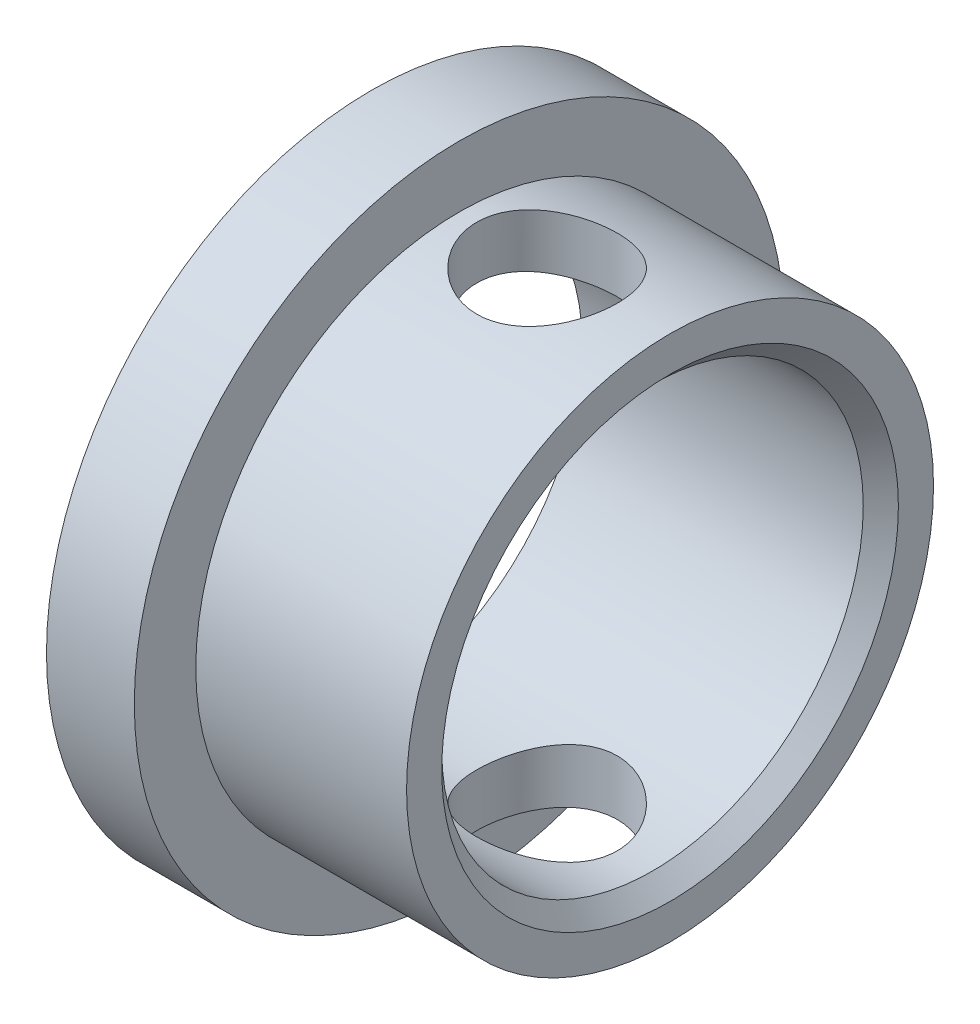
ISO-10303-21;
HEADER;
FILE_DESCRIPTION(('STEP AP214'),'2;1');
FILE_NAME('part.step','',(''),(''),'','','');
FILE_SCHEMA(('AUTOMOTIVE_DESIGN { 1 0 10303 214 1 1 1 1 }'));
ENDSEC;
DATA;
#1=APPLICATION_CONTEXT('core data for automotive mechanical design processes');
#2=APPLICATION_PROTOCOL_DEFINITION('international standard','automotive_design',2000,#1);
#3=PRODUCT_CONTEXT('',#1,'mechanical');
#4=PRODUCT('Part','Part','',(#3));
#5=PRODUCT_RELATED_PRODUCT_CATEGORY('part','',(#4));
#6=PRODUCT_DEFINITION_FORMATION('','',#4);
#7=PRODUCT_DEFINITION_CONTEXT('part definition',#1,'design');
#8=PRODUCT_DEFINITION('design','',#6,#7);
#9=PRODUCT_DEFINITION_SHAPE('','',#8);
#10=(LENGTH_UNIT() NAMED_UNIT(*) SI_UNIT(.MILLI.,.METRE.));
#11=(NAMED_UNIT(*) PLANE_ANGLE_UNIT() SI_UNIT($,.RADIAN.));
#12=(NAMED_UNIT(*) SI_UNIT($,.STERADIAN.) SOLID_ANGLE_UNIT());
#13=UNCERTAINTY_MEASURE_WITH_UNIT(LENGTH_MEASURE(1.E-05),#10,'distance_accuracy_value','');
#14=(GEOMETRIC_REPRESENTATION_CONTEXT(3) GLOBAL_UNCERTAINTY_ASSIGNED_CONTEXT((#13)) GLOBAL_UNIT_ASSIGNED_CONTEXT((#10,
#11,#12)) REPRESENTATION_CONTEXT('',''));
#15=CARTESIAN_POINT('',(0.,0.,0.));
#16=DIRECTION('',(0.,0.,1.));
#17=DIRECTION('',(1.,0.,0.));
#18=AXIS2_PLACEMENT_3D('',#15,#16,#17);
#19=CARTESIAN_POINT('',(12.,0.,0.));
#20=DIRECTION('',(1.,0.,0.));
#21=DIRECTION('',(0.,0.,-1.));
#22=AXIS2_PLACEMENT_3D('',#19,#20,#21);
#23=PLANE('',#22);
#24=CARTESIAN_POINT('',(12.,0.,0.));
#25=DIRECTION('',(1.,0.,0.));
#26=DIRECTION('',(0.,0.,-1.));
#27=AXIS2_PLACEMENT_3D('',#24,#25,#26);
#28=CIRCLE('',#27,13.);
#29=CARTESIAN_POINT('',(12.,0.,-13.));
#30=VERTEX_POINT('',#29);
#31=EDGE_CURVE('E10',#30,#30,#28,.F.);
#32=ORIENTED_EDGE('',*,*,#31,.T.);
#33=EDGE_LOOP('',(#32));
#34=FACE_BOUND('',#33,.T.);
#35=CARTESIAN_POINT('',(12.,0.,0.));
#36=DIRECTION('',(1.,0.,0.));
#37=DIRECTION('',(0.,0.,-1.));
#38=AXIS2_PLACEMENT_3D('',#35,#36,#37);
#39=CIRCLE('',#38,15.);
#40=CARTESIAN_POINT('',(12.,0.,-15.));
#41=VERTEX_POINT('',#40);
#42=EDGE_CURVE('E49',#41,#41,#39,.T.);
#43=ORIENTED_EDGE('',*,*,#42,.T.);
#44=EDGE_LOOP('',(#43));
#45=FACE_BOUND('',#44,.T.);
#46=ADVANCED_FACE('F32',(#34,#45),#23,.T.);
#47=CARTESIAN_POINT('',(12.,0.,0.));
#48=DIRECTION('',(-1.,0.,0.));
#49=DIRECTION('',(0.,0.,1.));
#50=AXIS2_PLACEMENT_3D('',#47,#48,#49);
#51=CYLINDRICAL_SURFACE('',#50,15.);
#52=CARTESIAN_POINT('',(5.,-14.456832294801,4.));
#53=CARTESIAN_POINT('',(5.22035187548057,-14.456836113945,3.99999468631742));
#54=CARTESIAN_POINT('',(5.44076000095203,-14.4619252909935,3.98172986449485));
#55=CARTESIAN_POINT('',(5.87521084311275,-14.4816712231019,3.90929166520474));
#56=CARTESIAN_POINT('',(6.08925030995612,-14.4963327781587,3.85510027241905));
#57=CARTESIAN_POINT('',(6.50461613989356,-14.5334475035368,3.71271691120147));
#58=CARTESIAN_POINT('',(6.70595991765685,-14.5558897136841,3.62457275084355));
#59=CARTESIAN_POINT('',(7.09103348011965,-14.606023098408,3.41693569127407));
#60=CARTESIAN_POINT('',(7.27476189501397,-14.6337146806885,3.29744035682899));
#61=CARTESIAN_POINT('',(7.62398509397544,-14.6920027910693,3.02729695749119));
#62=CARTESIAN_POINT('',(7.78897403492892,-14.7226508223289,2.87600595008417));
#63=CARTESIAN_POINT('',(8.0915631539024,-14.7829540287301,2.54794854568042));
#64=CARTESIAN_POINT('',(8.22916049228359,-14.8126091006688,2.37117951069329));
#65=CARTESIAN_POINT('',(8.47516987680586,-14.8681597693684,1.99367634174654));
#66=CARTESIAN_POINT('',(8.58307903726571,-14.8939875252459,1.79260363975896));
#67=CARTESIAN_POINT('',(8.76336927073451,-14.9383825242367,1.37436608945818));
#68=CARTESIAN_POINT('',(8.83575633456311,-14.9569509915253,1.1572039617502));
#69=CARTESIAN_POINT('',(8.94131044047154,-14.9843710715292,0.718231923620179));
#70=CARTESIAN_POINT('',(8.97533795325184,-14.9934355350053,0.496642448401832));
#71=CARTESIAN_POINT('',(9.00591424021435,-15.001570492355,0.0507271070171479));
#72=CARTESIAN_POINT('',(9.00246928726027,-15.0006426589323,-0.173598294877067));
#73=CARTESIAN_POINT('',(8.95880437492107,-14.9890535171952,-0.61262847422269));
#74=CARTESIAN_POINT('',(8.91951408472746,-14.9786382805395,-0.827433201442203));
#75=CARTESIAN_POINT('',(8.80677572443606,-14.9495349718099,-1.24728263114213));
#76=CARTESIAN_POINT('',(8.73332570662777,-14.9308464280136,-1.45232677636123));
#77=CARTESIAN_POINT('',(8.55364030481539,-14.886931381996,-1.84920789029504));
#78=CARTESIAN_POINT('',(8.44708638579915,-14.8616417575466,-2.04089337265881));
#79=CARTESIAN_POINT('',(8.20446236098126,-14.8072493701969,-2.40397999752931));
#80=CARTESIAN_POINT('',(8.0683865019416,-14.7781458644853,-2.57537717617274));
#81=CARTESIAN_POINT('',(7.76564628413429,-14.7182254587483,-2.89857073893016));
#82=CARTESIAN_POINT('',(7.59817110990927,-14.6873833872759,-3.04960384035149));
#83=CARTESIAN_POINT('',(7.23995064751438,-14.6282681005693,-3.32162664209938));
#84=CARTESIAN_POINT('',(7.04920394156929,-14.5999950420307,-3.44261451061104));
#85=CARTESIAN_POINT('',(6.64819979638067,-14.549118045243,-3.651693583714));
#86=CARTESIAN_POINT('',(6.43782929827193,-14.5265501404503,-3.73957733196031));
#87=CARTESIAN_POINT('',(6.00454700119227,-14.4900865003605,-3.87848003366226));
#88=CARTESIAN_POINT('',(5.7816383271305,-14.4761886145698,-3.92950812921312));
#89=CARTESIAN_POINT('',(5.3367455779215,-14.459096712616,-3.99193514186922));
#90=CARTESIAN_POINT('',(5.11493290275154,-14.4555952643646,-4.00447265242678));
#91=CARTESIAN_POINT('',(4.67238045438873,-14.4588515677209,-3.99269962245616));
#92=CARTESIAN_POINT('',(4.45164056952165,-14.4656082275034,-3.96839300344559));
#93=CARTESIAN_POINT('',(4.02188681181539,-14.4883224864021,-3.88462543740026));
#94=CARTESIAN_POINT('',(3.81272912412513,-14.5041007939926,-3.82584895825867));
#95=CARTESIAN_POINT('',(3.40724073728054,-14.542905379049,-3.67557973450926));
#96=CARTESIAN_POINT('',(3.21091171714526,-14.5659326029695,-3.58408271753296));
#97=CARTESIAN_POINT('',(2.83189008512946,-14.6172714494615,-3.3686581101742));
#98=CARTESIAN_POINT('',(2.6495920482205,-14.6456880974578,-3.2440619047585));
#99=CARTESIAN_POINT('',(2.30807339659372,-14.7043568386728,-2.96680455975028));
#100=CARTESIAN_POINT('',(2.14885713009171,-14.7346092762046,-2.81413814445933));
#101=CARTESIAN_POINT('',(1.85329505350015,-14.7945992976893,-2.47980756500969));
#102=CARTESIAN_POINT('',(1.71774324604283,-14.824296730477,-2.2974328320177));
#103=CARTESIAN_POINT('',(1.47917802517897,-14.8789334003425,-1.91185687188149));
#104=CARTESIAN_POINT('',(1.37616287984216,-14.9038728906581,-1.70865675403777));
#105=CARTESIAN_POINT('',(1.20654073527698,-14.9460230179852,-1.28862826965175));
#106=CARTESIAN_POINT('',(1.13966196111306,-14.9632911696077,-1.07191570576467));
#107=CARTESIAN_POINT('',(1.04342254387128,-14.9884060757449,-0.629798769462639));
#108=CARTESIAN_POINT('',(1.01405358645064,-14.9962549180996,-0.404396334640487));
#109=CARTESIAN_POINT('',(0.994188352517124,-15.0015482687538,0.0412840026922978));
#110=CARTESIAN_POINT('',(1.00252736173765,-14.9993045257616,0.261507023055727));
#111=CARTESIAN_POINT('',(1.05513698715042,-14.9853698195772,0.697296609261435));
#112=CARTESIAN_POINT('',(1.09940625423409,-14.9736792110957,0.912863349625628));
#113=CARTESIAN_POINT('',(1.2219612098372,-14.9422262078185,1.33182024692842));
#114=CARTESIAN_POINT('',(1.30001058694488,-14.9225199437846,1.53528402370308));
#115=CARTESIAN_POINT('',(1.48769920349248,-14.8770963303299,1.92634419694271));
#116=CARTESIAN_POINT('',(1.59734287322563,-14.8513781379851,2.1139383633243));
#117=CARTESIAN_POINT('',(1.84851654427405,-14.7958266244824,2.47335653734734));
#118=CARTESIAN_POINT('',(1.99081876139732,-14.7659018674327,2.64462672346662));
#119=CARTESIAN_POINT('',(2.30180549872981,-14.7056800015451,2.96125074312266));
#120=CARTESIAN_POINT('',(2.4704969516387,-14.6753827967944,3.10659774486097));
#121=CARTESIAN_POINT('',(2.8339367916352,-14.6170791927771,3.37041400465123));
#122=CARTESIAN_POINT('',(3.02917662731442,-14.5891378244929,3.48822188522467));
#123=CARTESIAN_POINT('',(3.43741262172047,-14.5396278780694,3.68917378060109));
#124=CARTESIAN_POINT('',(3.65039705707896,-14.5180551344989,3.77234046734664));
#125=CARTESIAN_POINT('',(4.05216267210251,-14.4867200130775,3.89076248504962));
#126=CARTESIAN_POINT('',(4.23920252911343,-14.4756028054439,3.93163036798979));
#127=CARTESIAN_POINT('',(4.61748111598794,-14.4606577042314,3.98624988587759));
#128=CARTESIAN_POINT('',(4.80871936457762,-14.4568289795203,4.0000046126432));
#129=CARTESIAN_POINT('',(5.,-14.456832294801,4.));
#130=B_SPLINE_CURVE_WITH_KNOTS('',3,(#52,#53,#54,#55,#56,#57,#58,#59,#60,#61,#62,#63,#64,#65,
#66,#67,#68,#69,#70,#71,#72,#73,#74,#75,#76,#77,#78,#79,#80,#81,#82,#83,#84,#85,#86,#87,#88,#89,
#90,#91,#92,#93,#94,#95,#96,#97,#98,#99,#100,#101,#102,#103,#104,#105,#106,#107,#108,#109,#110,
#111,#112,#113,#114,#115,#116,#117,#118,#119,#120,#121,#122,#123,#124,#125,#126,#127,#128,#129),
.UNSPECIFIED.,.T.,.F.,(4,2,2,2,2,2,2,2,2,2,2,2,2,2,2,2,2,2,2,2,2,2,2,2,2,2,2,2,2,2,2,2,2,2,2,2,
2,2,4),(0.,0.660352256232052,1.3210358957004,1.98079262319234,2.64060061312209,3.31531832260422,
3.99010594248923,4.67570414741607,5.36118668608492,6.03096608632961,6.70063336771206,
7.35341141601607,8.00622668881391,8.66552897811141,9.32495986788983,10.0046352460066,
10.6843520527916,11.3682603019536,12.0519988484194,12.7153066848897,13.3785439269193,
14.0290370087007,14.6796150573457,15.3444926994046,16.0094954308787,16.6937181392419,
17.3779044202113,18.0568707918772,18.7356866392293,19.3936810983785,20.0516508523085,
20.7050902974225,21.3586214153685,22.0295770798807,22.7007093076702,23.3866007797608,
24.0720426420754,24.6453393534799,25.2185706858622),.UNSPECIFIED.);
#131=CARTESIAN_POINT('',(5.,-14.456832294801,4.));
#132=VERTEX_POINT('',#131);
#133=EDGE_CURVE('E77',#132,#132,#130,.T.);
#134=ORIENTED_EDGE('',*,*,#133,.T.);
#135=EDGE_LOOP('',(#134));
#136=FACE_BOUND('',#135,.T.);
#137=CARTESIAN_POINT('',(5.,14.456832294801,4.));
#138=CARTESIAN_POINT('',(4.77964812451943,14.456836113945,3.99999468631742));
#139=CARTESIAN_POINT('',(4.55923999904797,14.4619252909935,3.98172986449485));
#140=CARTESIAN_POINT('',(4.12478915688725,14.4816712231019,3.90929166520474));
#141=CARTESIAN_POINT('',(3.91074969004388,14.4963327781587,3.85510027241905));
#142=CARTESIAN_POINT('',(3.49538386010644,14.5334475035368,3.71271691120147));
#143=CARTESIAN_POINT('',(3.29404008234315,14.5558897136841,3.62457275084355));
#144=CARTESIAN_POINT('',(2.90896651988035,14.606023098408,3.41693569127407));
#145=CARTESIAN_POINT('',(2.72523810498603,14.6337146806885,3.29744035682899));
#146=CARTESIAN_POINT('',(2.37601490602456,14.6920027910693,3.02729695749119));
#147=CARTESIAN_POINT('',(2.21102596507108,14.7226508223289,2.87600595008417));
#148=CARTESIAN_POINT('',(1.9084368460976,14.7829540287301,2.54794854568042));
#149=CARTESIAN_POINT('',(1.77083950771641,14.8126091006688,2.37117951069329));
#150=CARTESIAN_POINT('',(1.52483012319415,14.8681597693684,1.99367634174654));
#151=CARTESIAN_POINT('',(1.41692096273429,14.8939875252459,1.79260363975896));
#152=CARTESIAN_POINT('',(1.23663072926549,14.9383825242367,1.37436608945818));
#153=CARTESIAN_POINT('',(1.16424366543689,14.9569509915253,1.1572039617502));
#154=CARTESIAN_POINT('',(1.05868955952846,14.9843710715292,0.718231923620178));
#155=CARTESIAN_POINT('',(1.02466204674816,14.9934355350053,0.496642448401831));
#156=CARTESIAN_POINT('',(0.99408575978565,15.001570492355,0.0507271070171473));
#157=CARTESIAN_POINT('',(0.99753071273973,15.0006426589323,-0.173598294877067));
#158=CARTESIAN_POINT('',(1.04119562507893,14.9890535171952,-0.61262847422269));
#159=CARTESIAN_POINT('',(1.08048591527254,14.9786382805395,-0.827433201442204));
#160=CARTESIAN_POINT('',(1.19322427556394,14.9495349718099,-1.24728263114213));
#161=CARTESIAN_POINT('',(1.26667429337223,14.9308464280136,-1.45232677636123));
#162=CARTESIAN_POINT('',(1.44635969518461,14.886931381996,-1.84920789029504));
#163=CARTESIAN_POINT('',(1.55291361420085,14.8616417575466,-2.04089337265881));
#164=CARTESIAN_POINT('',(1.79553763901874,14.8072493701969,-2.40397999752931));
#165=CARTESIAN_POINT('',(1.9316134980584,14.7781458644853,-2.57537717617274));
#166=CARTESIAN_POINT('',(2.23435371586571,14.7182254587483,-2.89857073893016));
#167=CARTESIAN_POINT('',(2.40182889009073,14.6873833872759,-3.04960384035149));
#168=CARTESIAN_POINT('',(2.76004935248561,14.6282681005693,-3.32162664209938));
#169=CARTESIAN_POINT('',(2.95079605843071,14.5999950420307,-3.44261451061104));
#170=CARTESIAN_POINT('',(3.35180020361933,14.549118045243,-3.651693583714));
#171=CARTESIAN_POINT('',(3.56217070172807,14.5265501404503,-3.73957733196031));
#172=CARTESIAN_POINT('',(3.99545299880773,14.4900865003605,-3.87848003366226));
#173=CARTESIAN_POINT('',(4.21836167286949,14.4761886145698,-3.92950812921312));
#174=CARTESIAN_POINT('',(4.6632544220785,14.459096712616,-3.99193514186922));
#175=CARTESIAN_POINT('',(4.88506709724846,14.4555952643646,-4.00447265242678));
#176=CARTESIAN_POINT('',(5.32761954561127,14.4588515677209,-3.99269962245616));
#177=CARTESIAN_POINT('',(5.54835943047835,14.4656082275034,-3.96839300344559));
#178=CARTESIAN_POINT('',(5.97811318818461,14.4883224864021,-3.88462543740026));
#179=CARTESIAN_POINT('',(6.18727087587487,14.5041007939926,-3.82584895825867));
#180=CARTESIAN_POINT('',(6.59275926271946,14.542905379049,-3.67557973450926));
#181=CARTESIAN_POINT('',(6.78908828285474,14.5659326029695,-3.58408271753296));
#182=CARTESIAN_POINT('',(7.16810991487054,14.6172714494615,-3.3686581101742));
#183=CARTESIAN_POINT('',(7.3504079517795,14.6456880974578,-3.2440619047585));
#184=CARTESIAN_POINT('',(7.69192660340628,14.7043568386728,-2.96680455975028));
#185=CARTESIAN_POINT('',(7.85114286990829,14.7346092762046,-2.81413814445933));
#186=CARTESIAN_POINT('',(8.14670494649985,14.7945992976893,-2.47980756500969));
#187=CARTESIAN_POINT('',(8.28225675395717,14.824296730477,-2.2974328320177));
#188=CARTESIAN_POINT('',(8.52082197482103,14.8789334003425,-1.91185687188149));
#189=CARTESIAN_POINT('',(8.62383712015784,14.9038728906581,-1.70865675403777));
#190=CARTESIAN_POINT('',(8.79345926472302,14.9460230179852,-1.28862826965174));
#191=CARTESIAN_POINT('',(8.86033803888694,14.9632911696077,-1.07191570576467));
#192=CARTESIAN_POINT('',(8.95657745612872,14.9884060757449,-0.629798769462639));
#193=CARTESIAN_POINT('',(8.98594641354936,14.9962549180996,-0.404396334640485));
#194=CARTESIAN_POINT('',(9.00581164748288,15.0015482687538,0.0412840026922997));
#195=CARTESIAN_POINT('',(8.99747263826235,14.9993045257616,0.261507023055729));
#196=CARTESIAN_POINT('',(8.94486301284958,14.9853698195772,0.697296609261437));
#197=CARTESIAN_POINT('',(8.90059374576591,14.9736792110957,0.91286334962563));
#198=CARTESIAN_POINT('',(8.7780387901628,14.9422262078185,1.33182024692842));
#199=CARTESIAN_POINT('',(8.69998941305512,14.9225199437846,1.53528402370308));
#200=CARTESIAN_POINT('',(8.51230079650752,14.8770963303299,1.92634419694271));
#201=CARTESIAN_POINT('',(8.40265712677437,14.8513781379851,2.1139383633243));
#202=CARTESIAN_POINT('',(8.15148345572595,14.7958266244824,2.47335653734734));
#203=CARTESIAN_POINT('',(8.00918123860268,14.7659018674327,2.64462672346663));
#204=CARTESIAN_POINT('',(7.69819450127019,14.7056800015451,2.96125074312266));
#205=CARTESIAN_POINT('',(7.5295030483613,14.6753827967944,3.10659774486097));
#206=CARTESIAN_POINT('',(7.1660632083648,14.6170791927771,3.37041400465123));
#207=CARTESIAN_POINT('',(6.97082337268558,14.5891378244929,3.48822188522467));
#208=CARTESIAN_POINT('',(6.56258737827953,14.5396278780694,3.68917378060109));
#209=CARTESIAN_POINT('',(6.34960294292103,14.5180551344989,3.77234046734664));
#210=CARTESIAN_POINT('',(5.94783732789749,14.4867200130775,3.89076248504962));
#211=CARTESIAN_POINT('',(5.76079747088657,14.4756028054439,3.93163036798979));
#212=CARTESIAN_POINT('',(5.38251888401206,14.4606577042314,3.98624988587759));
#213=CARTESIAN_POINT('',(5.19128063542238,14.4568289795203,4.0000046126432));
#214=CARTESIAN_POINT('',(5.,14.456832294801,4.));
#215=B_SPLINE_CURVE_WITH_KNOTS('',3,(#137,#138,#139,#140,#141,#142,#143,#144,#145,#146,#147,
#148,#149,#150,#151,#152,#153,#154,#155,#156,#157,#158,#159,#160,#161,#162,#163,#164,#165,#166,
#167,#168,#169,#170,#171,#172,#173,#174,#175,#176,#177,#178,#179,#180,#181,#182,#183,#184,#185,
#186,#187,#188,#189,#190,#191,#192,#193,#194,#195,#196,#197,#198,#199,#200,#201,#202,#203,#204,
#205,#206,#207,#208,#209,#210,#211,#212,#213,#214),.UNSPECIFIED.,.T.,.F.,(4,2,2,2,2,2,2,2,2,2,2,
2,2,2,2,2,2,2,2,2,2,2,2,2,2,2,2,2,2,2,2,2,2,2,2,2,2,2,4),(0.,0.660352256232051,1.3210358957004,
1.98079262319234,2.64060061312209,3.31531832260422,3.99010594248923,4.67570414741607,
5.36118668608492,6.03096608632961,6.70063336771206,7.35341141601607,8.00622668881391,
8.66552897811141,9.32495986788983,10.0046352460066,10.6843520527916,11.3682603019536,
12.0519988484194,12.7153066848897,13.3785439269193,14.0290370087007,14.6796150573457,
15.3444926994047,16.0094954308787,16.6937181392419,17.3779044202113,18.0568707918772,
18.7356866392293,19.3936810983785,20.0516508523085,20.7050902974225,21.3586214153685,
22.0295770798807,22.7007093076702,23.3866007797608,24.0720426420754,24.6453393534799,
25.2185706858622),.UNSPECIFIED.);
#216=CARTESIAN_POINT('',(5.,14.456832294801,4.));
#217=VERTEX_POINT('',#216);
#218=EDGE_CURVE('E73',#217,#217,#215,.T.);
#219=ORIENTED_EDGE('',*,*,#218,.T.);
#220=EDGE_LOOP('',(#219));
#221=FACE_BOUND('',#220,.T.);
#222=ORIENTED_EDGE('',*,*,#42,.F.);
#223=EDGE_LOOP('',(#222));
#224=FACE_BOUND('',#223,.T.);
#225=CARTESIAN_POINT('',(0.,0.,0.));
#226=DIRECTION('',(-1.,0.,0.));
#227=DIRECTION('',(0.,0.,1.));
#228=AXIS2_PLACEMENT_3D('',#225,#226,#227);
#229=CIRCLE('',#228,15.);
#230=CARTESIAN_POINT('',(0.,0.,15.));
#231=VERTEX_POINT('',#230);
#232=EDGE_CURVE('E93',#231,#231,#229,.T.);
#233=ORIENTED_EDGE('',*,*,#232,.F.);
#234=EDGE_LOOP('',(#233));
#235=FACE_BOUND('',#234,.T.);
#236=ADVANCED_FACE('F81',(#136,#221,#224,#235),#51,.T.);
#237=CARTESIAN_POINT('',(12.,0.,0.));
#238=DIRECTION('',(-1.,0.,0.));
#239=DIRECTION('',(0.,0.,1.));
#240=AXIS2_PLACEMENT_3D('',#237,#238,#239);
#241=CYLINDRICAL_SURFACE('',#240,12.);
#242=CARTESIAN_POINT('',(5.,-11.3137084989848,4.));
#243=CARTESIAN_POINT('',(5.21787269934429,-11.3137077812174,4.00000103179085));
#244=CARTESIAN_POINT('',(5.43573919929437,-11.3200707716343,3.98213913474209));
#245=CARTESIAN_POINT('',(5.865017683977,-11.3447029632502,3.91140452675524));
#246=CARTESIAN_POINT('',(6.07642859948988,-11.3629741256875,3.85852604867359));
#247=CARTESIAN_POINT('',(6.48650757198915,-11.4091281475517,3.71982194273962));
#248=CARTESIAN_POINT('',(6.68519971777087,-11.4369921588529,3.63406088561298));
#249=CARTESIAN_POINT('',(7.06544019419185,-11.499164880413,3.43224651376552));
#250=CARTESIAN_POINT('',(7.24698473021453,-11.5334750121445,3.31618651544073));
#251=CARTESIAN_POINT('',(7.59487984935326,-11.6061795762989,3.05220458577151));
#252=CARTESIAN_POINT('',(7.76046171468691,-11.6446757937858,2.90329736551168));
#253=CARTESIAN_POINT('',(8.06482720489856,-11.7205545920401,2.57995066885758));
#254=CARTESIAN_POINT('',(8.20360652632948,-11.7579369931585,2.4055071002095));
#255=CARTESIAN_POINT('',(8.45391558931837,-11.828554676872,2.03041803186004));
#256=CARTESIAN_POINT('',(8.56463988247183,-11.8616563080642,1.8292076448981));
#257=CARTESIAN_POINT('',(8.75036634051004,-11.9187834708393,1.40972489194989));
#258=CARTESIAN_POINT('',(8.82537813270763,-11.9428114481201,1.19145714274885));
#259=CARTESIAN_POINT('',(8.93494341852957,-11.9783630172763,0.752115269733976));
#260=CARTESIAN_POINT('',(8.97081378502803,-11.9902925911024,0.531403019411872));
#261=CARTESIAN_POINT('',(9.00526517344264,-12.0017443287299,0.0867914992963559));
#262=CARTESIAN_POINT('',(9.00385580660965,-12.0012696905158,-0.137106934175587));
#263=CARTESIAN_POINT('',(8.96462298173589,-11.9882415847493,-0.57241406077526));
#264=CARTESIAN_POINT('',(8.92822988610205,-11.9761625902047,-0.783968194366629));
#265=CARTESIAN_POINT('',(8.82242807607811,-11.9418786935893,-1.19777375528869));
#266=CARTESIAN_POINT('',(8.7530171240807,-11.9196731052473,-1.40002455111687));
#267=CARTESIAN_POINT('',(8.58231473077576,-11.867026811729,-1.79260989936789));
#268=CARTESIAN_POINT('',(8.48061624581395,-11.8364817009606,-1.98275288387538));
#269=CARTESIAN_POINT('',(8.24856117820538,-11.7703357215568,-2.34369730210929));
#270=CARTESIAN_POINT('',(8.11819662668948,-11.7347334480587,-2.51449333754137));
#271=CARTESIAN_POINT('',(7.8253024261612,-11.6602476739959,-2.84040346620523));
#272=CARTESIAN_POINT('',(7.66154736863407,-11.6212886067551,-2.99440062826109));
#273=CARTESIAN_POINT('',(7.31020509709352,-11.545893409956,-3.2731090383927));
#274=CARTESIAN_POINT('',(7.12261421708782,-11.5094576698246,-3.39781577312617));
#275=CARTESIAN_POINT('',(6.72538549758624,-11.4428210048445,-3.61594982014297));
#276=CARTESIAN_POINT('',(6.5154714747289,-11.4127163713899,-3.70890585448536));
#277=CARTESIAN_POINT('',(6.08171442314233,-11.3632660329754,-3.85777277307735));
#278=CARTESIAN_POINT('',(5.85787727517502,-11.3439158194837,-3.91369918298998));
#279=CARTESIAN_POINT('',(5.4134465783537,-11.3191854526234,-3.98464512839009));
#280=CARTESIAN_POINT('',(5.19316230100537,-11.3132144127502,-4.00139638203053));
#281=CARTESIAN_POINT('',(4.75289540354357,-11.3142668823674,-3.99842175563888));
#282=CARTESIAN_POINT('',(4.53291273590404,-11.3212880316726,-3.97870250090705));
#283=CARTESIAN_POINT('',(4.10737213715236,-11.346944723612,-3.90490260620924));
#284=CARTESIAN_POINT('',(3.90157827939663,-11.3651730176336,-3.85202557592274));
#285=CARTESIAN_POINT('',(3.50182557504326,-11.4107421468409,-3.71485545024187));
#286=CARTESIAN_POINT('',(3.30786883363688,-11.4380845973936,-3.63055678545369));
#287=CARTESIAN_POINT('',(2.93047831661201,-11.4998751038315,-3.42989736295575));
#288=CARTESIAN_POINT('',(2.74757342943279,-11.5345210266251,-3.31260447343399));
#289=CARTESIAN_POINT('',(2.40341579046512,-11.6066307492386,-3.05034252223023));
#290=CARTESIAN_POINT('',(2.24216944535512,-11.6440953777518,-2.90536530199513));
#291=CARTESIAN_POINT('',(1.93788806363744,-11.719801545514,-2.5835668236013));
#292=CARTESIAN_POINT('',(1.7961024399246,-11.7579937431159,-2.40554908218661));
#293=CARTESIAN_POINT('',(1.54433543060783,-11.8290740645244,-2.02730916560103));
#294=CARTESIAN_POINT('',(1.4343529153503,-11.8619623767078,-1.82708777945821));
#295=CARTESIAN_POINT('',(1.25031958055314,-11.9185762324241,-1.41111944972918));
#296=CARTESIAN_POINT('',(1.17603489140774,-11.9423612001812,-1.19548449328479));
#297=CARTESIAN_POINT('',(1.06508903175958,-11.978344433511,-0.753833863384064));
#298=CARTESIAN_POINT('',(1.02841428047799,-11.9905468813608,-0.527821967815556));
#299=CARTESIAN_POINT('',(0.99495168957743,-12.0016745294503,-0.0832613434401621));
#300=CARTESIAN_POINT('',(0.996370184270489,-12.0011968035776,0.135138895680076));
#301=CARTESIAN_POINT('',(1.03462923258563,-11.9884878607759,0.568444580000697));
#302=CARTESIAN_POINT('',(1.07146691261107,-11.976257597343,0.783350307276229));
#303=CARTESIAN_POINT('',(1.17832893830385,-11.9416365981765,1.20016847772824));
#304=CARTESIAN_POINT('',(1.24781686141173,-11.9194103344459,1.40223308365116));
#305=CARTESIAN_POINT('',(1.41751012438862,-11.8670864281798,1.79191340375918));
#306=CARTESIAN_POINT('',(1.51772102078805,-11.8369873619207,1.97952649656973));
#307=CARTESIAN_POINT('',(1.75027804840803,-11.7706347531152,2.34253606523514));
#308=CARTESIAN_POINT('',(1.88367474152656,-11.7341948996771,2.51722500623043));
#309=CARTESIAN_POINT('',(2.17702956462478,-11.6597195516752,2.84232410508971));
#310=CARTESIAN_POINT('',(2.33699616905091,-11.6216835509239,2.99272648649837));
#311=CARTESIAN_POINT('',(2.68643742234779,-11.5465311930239,3.27096723533247));
#312=CARTESIAN_POINT('',(2.87682204390656,-11.5095091195452,3.3976918639916));
#313=CARTESIAN_POINT('',(3.27733770761112,-11.4424077329206,3.61725737320446));
#314=CARTESIAN_POINT('',(3.48746357211866,-11.41232660645,3.7101071072779));
#315=CARTESIAN_POINT('',(3.91184729606253,-11.3640533682606,3.85537531281666));
#316=CARTESIAN_POINT('',(4.12548905410146,-11.3453853142873,3.90943163659808));
#317=CARTESIAN_POINT('',(4.55942420186681,-11.3202153415807,3.98173728059707));
#318=CARTESIAN_POINT('',(4.77971526964284,-11.3137092246984,3.99999895678637));
#319=CARTESIAN_POINT('',(5.,-11.3137084989848,4.));
#320=B_SPLINE_CURVE_WITH_KNOTS('',3,(#242,#243,#244,#245,#246,#247,#248,#249,#250,#251,#252,
#253,#254,#255,#256,#257,#258,#259,#260,#261,#262,#263,#264,#265,#266,#267,#268,#269,#270,#271,
#272,#273,#274,#275,#276,#277,#278,#279,#280,#281,#282,#283,#284,#285,#286,#287,#288,#289,#290,
#291,#292,#293,#294,#295,#296,#297,#298,#299,#300,#301,#302,#303,#304,#305,#306,#307,#308,#309,
#310,#311,#312,#313,#314,#315,#316,#317,#318,#319),.UNSPECIFIED.,.T.,.F.,(4,2,2,2,2,2,2,2,2,2,2,
2,2,2,2,2,2,2,2,2,2,2,2,2,2,2,2,2,2,2,2,2,2,2,2,2,2,2,4),(0.,0.652802339197424,1.30571222006066,
1.95734651000331,2.60912466474177,3.28405349710273,3.95909060687952,4.65174024574629,
5.34420305547157,6.01257275059737,6.68077013209309,7.32276019302276,7.96479376756947,
8.6152661944134,9.26591967496088,9.94720697455671,10.6285991844842,11.3197055937222,
12.0105220542646,12.6701716545776,13.3297014334894,13.9665758307511,14.6035631658778,
15.2607543094286,15.9181394264851,16.6071523268437,17.2961407503013,17.9805516476341,
18.6647153201663,19.3167233871054,19.9686785603913,20.6102782416172,21.2519940305297,
21.9174207808253,22.5830601773053,23.2747561094458,23.9662711306747,24.6265284865076,
25.2865578876185),.UNSPECIFIED.);
#321=CARTESIAN_POINT('',(5.,-11.3137084989848,4.));
#322=VERTEX_POINT('',#321);
#323=EDGE_CURVE('E36',#322,#322,#320,.T.);
#324=ORIENTED_EDGE('',*,*,#323,.F.);
#325=EDGE_LOOP('',(#324));
#326=FACE_BOUND('',#325,.T.);
#327=CARTESIAN_POINT('',(5.,11.3137084989848,4.));
#328=CARTESIAN_POINT('',(4.78212730065571,11.3137077812174,4.00000103179085));
#329=CARTESIAN_POINT('',(4.56426080070563,11.3200707716343,3.98213913474209));
#330=CARTESIAN_POINT('',(4.134982316023,11.3447029632502,3.91140452675524));
#331=CARTESIAN_POINT('',(3.92357140051012,11.3629741256875,3.85852604867359));
#332=CARTESIAN_POINT('',(3.51349242801085,11.4091281475517,3.71982194273962));
#333=CARTESIAN_POINT('',(3.31480028222913,11.4369921588529,3.63406088561298));
#334=CARTESIAN_POINT('',(2.93455980580815,11.499164880413,3.43224651376552));
#335=CARTESIAN_POINT('',(2.75301526978547,11.5334750121445,3.31618651544073));
#336=CARTESIAN_POINT('',(2.40512015064674,11.6061795762989,3.05220458577151));
#337=CARTESIAN_POINT('',(2.23953828531309,11.6446757937858,2.90329736551168));
#338=CARTESIAN_POINT('',(1.93517279510144,11.7205545920401,2.57995066885758));
#339=CARTESIAN_POINT('',(1.79639347367052,11.7579369931585,2.4055071002095));
#340=CARTESIAN_POINT('',(1.54608441068163,11.828554676872,2.03041803186004));
#341=CARTESIAN_POINT('',(1.43536011752816,11.8616563080642,1.8292076448981));
#342=CARTESIAN_POINT('',(1.24963365948996,11.9187834708393,1.40972489194989));
#343=CARTESIAN_POINT('',(1.17462186729238,11.9428114481201,1.19145714274885));
#344=CARTESIAN_POINT('',(1.06505658147043,11.9783630172763,0.752115269733976));
#345=CARTESIAN_POINT('',(1.02918621497197,11.9902925911024,0.531403019411872));
#346=CARTESIAN_POINT('',(0.994734826557361,12.0017443287299,0.0867914992963568));
#347=CARTESIAN_POINT('',(0.996144193390349,12.0012696905158,-0.137106934175587));
#348=CARTESIAN_POINT('',(1.03537701826411,11.9882415847493,-0.57241406077526));
#349=CARTESIAN_POINT('',(1.07177011389795,11.9761625902047,-0.783968194366628));
#350=CARTESIAN_POINT('',(1.17757192392189,11.9418786935893,-1.19777375528869));
#351=CARTESIAN_POINT('',(1.2469828759193,11.9196731052473,-1.40002455111687));
#352=CARTESIAN_POINT('',(1.41768526922423,11.867026811729,-1.79260989936789));
#353=CARTESIAN_POINT('',(1.51938375418605,11.8364817009606,-1.98275288387538));
#354=CARTESIAN_POINT('',(1.75143882179462,11.7703357215568,-2.34369730210929));
#355=CARTESIAN_POINT('',(1.88180337331052,11.7347334480587,-2.51449333754137));
#356=CARTESIAN_POINT('',(2.17469757383879,11.6602476739959,-2.84040346620523));
#357=CARTESIAN_POINT('',(2.33845263136593,11.6212886067551,-2.99440062826109));
#358=CARTESIAN_POINT('',(2.68979490290647,11.545893409956,-3.2731090383927));
#359=CARTESIAN_POINT('',(2.87738578291218,11.5094576698246,-3.39781577312617));
#360=CARTESIAN_POINT('',(3.27461450241376,11.4428210048445,-3.61594982014297));
#361=CARTESIAN_POINT('',(3.4845285252711,11.4127163713899,-3.70890585448536));
#362=CARTESIAN_POINT('',(3.91828557685767,11.3632660329754,-3.85777277307735));
#363=CARTESIAN_POINT('',(4.14212272482498,11.3439158194837,-3.91369918298998));
#364=CARTESIAN_POINT('',(4.5865534216463,11.3191854526234,-3.98464512839009));
#365=CARTESIAN_POINT('',(4.80683769899463,11.3132144127502,-4.00139638203053));
#366=CARTESIAN_POINT('',(5.24710459645643,11.3142668823674,-3.99842175563888));
#367=CARTESIAN_POINT('',(5.46708726409596,11.3212880316726,-3.97870250090705));
#368=CARTESIAN_POINT('',(5.89262786284764,11.346944723612,-3.90490260620924));
#369=CARTESIAN_POINT('',(6.09842172060337,11.3651730176336,-3.85202557592274));
#370=CARTESIAN_POINT('',(6.49817442495674,11.4107421468409,-3.71485545024187));
#371=CARTESIAN_POINT('',(6.69213116636312,11.4380845973936,-3.63055678545369));
#372=CARTESIAN_POINT('',(7.06952168338799,11.4998751038315,-3.42989736295575));
#373=CARTESIAN_POINT('',(7.25242657056721,11.5345210266251,-3.31260447343399));
#374=CARTESIAN_POINT('',(7.59658420953488,11.6066307492386,-3.05034252223023));
#375=CARTESIAN_POINT('',(7.75783055464488,11.6440953777518,-2.90536530199513));
#376=CARTESIAN_POINT('',(8.06211193636256,11.719801545514,-2.5835668236013));
#377=CARTESIAN_POINT('',(8.2038975600754,11.7579937431159,-2.40554908218661));
#378=CARTESIAN_POINT('',(8.45566456939217,11.8290740645244,-2.02730916560103));
#379=CARTESIAN_POINT('',(8.5656470846497,11.8619623767078,-1.82708777945821));
#380=CARTESIAN_POINT('',(8.74968041944686,11.9185762324241,-1.41111944972918));
#381=CARTESIAN_POINT('',(8.82396510859227,11.9423612001812,-1.19548449328478));
#382=CARTESIAN_POINT('',(8.93491096824042,11.978344433511,-0.753833863384063));
#383=CARTESIAN_POINT('',(8.97158571952201,11.9905468813608,-0.527821967815556));
#384=CARTESIAN_POINT('',(9.00504831042257,12.0016745294503,-0.0832613434401622));
#385=CARTESIAN_POINT('',(9.00362981572951,12.0011968035776,0.135138895680075));
#386=CARTESIAN_POINT('',(8.96537076741437,11.9884878607759,0.568444580000697));
#387=CARTESIAN_POINT('',(8.92853308738892,11.976257597343,0.783350307276228));
#388=CARTESIAN_POINT('',(8.82167106169615,11.9416365981765,1.20016847772824));
#389=CARTESIAN_POINT('',(8.75218313858827,11.9194103344459,1.40223308365116));
#390=CARTESIAN_POINT('',(8.58248987561138,11.8670864281798,1.79191340375918));
#391=CARTESIAN_POINT('',(8.48227897921195,11.8369873619207,1.97952649656973));
#392=CARTESIAN_POINT('',(8.24972195159197,11.7706347531152,2.34253606523514));
#393=CARTESIAN_POINT('',(8.11632525847344,11.7341948996771,2.51722500623043));
#394=CARTESIAN_POINT('',(7.82297043537522,11.6597195516752,2.84232410508971));
#395=CARTESIAN_POINT('',(7.66300383094909,11.6216835509239,2.99272648649837));
#396=CARTESIAN_POINT('',(7.3135625776522,11.5465311930239,3.27096723533247));
#397=CARTESIAN_POINT('',(7.12317795609344,11.5095091195452,3.3976918639916));
#398=CARTESIAN_POINT('',(6.72266229238888,11.4424077329206,3.61725737320446));
#399=CARTESIAN_POINT('',(6.51253642788134,11.41232660645,3.7101071072779));
#400=CARTESIAN_POINT('',(6.08815270393747,11.3640533682606,3.85537531281666));
#401=CARTESIAN_POINT('',(5.87451094589854,11.3453853142873,3.90943163659808));
#402=CARTESIAN_POINT('',(5.44057579813319,11.3202153415807,3.98173728059707));
#403=CARTESIAN_POINT('',(5.22028473035716,11.3137092246984,3.99999895678637));
#404=CARTESIAN_POINT('',(5.,11.3137084989848,4.));
#405=B_SPLINE_CURVE_WITH_KNOTS('',3,(#327,#328,#329,#330,#331,#332,#333,#334,#335,#336,#337,
#338,#339,#340,#341,#342,#343,#344,#345,#346,#347,#348,#349,#350,#351,#352,#353,#354,#355,#356,
#357,#358,#359,#360,#361,#362,#363,#364,#365,#366,#367,#368,#369,#370,#371,#372,#373,#374,#375,
#376,#377,#378,#379,#380,#381,#382,#383,#384,#385,#386,#387,#388,#389,#390,#391,#392,#393,#394,
#395,#396,#397,#398,#399,#400,#401,#402,#403,#404),.UNSPECIFIED.,.T.,.F.,(4,2,2,2,2,2,2,2,2,2,2,
2,2,2,2,2,2,2,2,2,2,2,2,2,2,2,2,2,2,2,2,2,2,2,2,2,2,2,4),(0.,0.652802339197424,1.30571222006066,
1.95734651000331,2.60912466474177,3.28405349710273,3.95909060687952,4.65174024574629,
5.34420305547157,6.01257275059737,6.6807701320931,7.32276019302276,7.96479376756947,
8.6152661944134,9.26591967496088,9.94720697455671,10.6285991844842,11.3197055937222,
12.0105220542646,12.6701716545776,13.3297014334894,13.9665758307511,14.6035631658778,
15.2607543094286,15.9181394264851,16.6071523268437,17.2961407503013,17.9805516476341,
18.6647153201663,19.3167233871054,19.9686785603913,20.6102782416172,21.2519940305297,
21.9174207808254,22.5830601773053,23.2747561094458,23.9662711306747,24.6265284865076,
25.2865578876186),.UNSPECIFIED.);
#406=CARTESIAN_POINT('',(5.,11.3137084989848,4.));
#407=VERTEX_POINT('',#406);
#408=EDGE_CURVE('E52',#407,#407,#405,.T.);
#409=ORIENTED_EDGE('',*,*,#408,.F.);
#410=EDGE_LOOP('',(#409));
#411=FACE_BOUND('',#410,.T.);
#412=CARTESIAN_POINT('',(11.,0.,0.));
#413=DIRECTION('',(1.,0.,0.));
#414=DIRECTION('',(0.,0.,-1.));
#415=AXIS2_PLACEMENT_3D('',#412,#413,#414);
#416=CIRCLE('',#415,12.);
#417=CARTESIAN_POINT('',(11.,0.,-12.));
#418=VERTEX_POINT('',#417);
#419=EDGE_CURVE('E44',#418,#418,#416,.T.);
#420=ORIENTED_EDGE('',*,*,#419,.T.);
#421=EDGE_LOOP('',(#420));
#422=FACE_BOUND('',#421,.T.);
#423=CARTESIAN_POINT('',(-5.,0.,0.));
#424=DIRECTION('',(-1.,0.,0.));
#425=DIRECTION('',(0.,0.,1.));
#426=AXIS2_PLACEMENT_3D('',#423,#424,#425);
#427=CIRCLE('',#426,12.);
#428=CARTESIAN_POINT('',(-5.,0.,12.));
#429=VERTEX_POINT('',#428);
#430=EDGE_CURVE('E101',#429,#429,#427,.T.);
#431=ORIENTED_EDGE('',*,*,#430,.T.);
#432=EDGE_LOOP('',(#431));
#433=FACE_BOUND('',#432,.T.);
#434=ADVANCED_FACE('F56',(#326,#411,#422,#433),#241,.F.);
#435=CARTESIAN_POINT('',(0.,0.,0.));
#436=DIRECTION('',(-1.,0.,0.));
#437=DIRECTION('',(0.,0.,1.));
#438=AXIS2_PLACEMENT_3D('',#435,#436,#437);
#439=PLANE('',#438);
#440=CARTESIAN_POINT('',(0.,0.,0.));
#441=DIRECTION('',(-1.,0.,0.));
#442=DIRECTION('',(0.,0.,1.));
#443=AXIS2_PLACEMENT_3D('',#440,#441,#442);
#444=CIRCLE('',#443,18.5);
#445=CARTESIAN_POINT('',(0.,0.,18.5));
#446=VERTEX_POINT('',#445);
#447=EDGE_CURVE('E98',#446,#446,#444,.T.);
#448=ORIENTED_EDGE('',*,*,#447,.F.);
#449=EDGE_LOOP('',(#448));
#450=FACE_BOUND('',#449,.T.);
#451=ORIENTED_EDGE('',*,*,#232,.T.);
#452=EDGE_LOOP('',(#451));
#453=FACE_BOUND('',#452,.T.);
#454=ADVANCED_FACE('F114',(#450,#453),#439,.F.);
#455=CARTESIAN_POINT('',(-5.,0.,0.));
#456=DIRECTION('',(-1.,0.,0.));
#457=DIRECTION('',(0.,0.,1.));
#458=AXIS2_PLACEMENT_3D('',#455,#456,#457);
#459=PLANE('',#458);
#460=CARTESIAN_POINT('',(-5.,0.,0.));
#461=DIRECTION('',(-1.,0.,0.));
#462=DIRECTION('',(0.,0.,1.));
#463=AXIS2_PLACEMENT_3D('',#460,#461,#462);
#464=CIRCLE('',#463,18.5);
#465=CARTESIAN_POINT('',(-5.,0.,18.5));
#466=VERTEX_POINT('',#465);
#467=EDGE_CURVE('E95',#466,#466,#464,.T.);
#468=ORIENTED_EDGE('',*,*,#467,.T.);
#469=EDGE_LOOP('',(#468));
#470=FACE_BOUND('',#469,.T.);
#471=ORIENTED_EDGE('',*,*,#430,.F.);
#472=EDGE_LOOP('',(#471));
#473=FACE_BOUND('',#472,.T.);
#474=ADVANCED_FACE('F66',(#470,#473),#459,.T.);
#475=CARTESIAN_POINT('',(-5.,0.,0.));
#476=DIRECTION('',(1.,0.,0.));
#477=DIRECTION('',(0.,0.,-1.));
#478=AXIS2_PLACEMENT_3D('',#475,#476,#477);
#479=CYLINDRICAL_SURFACE('',#478,18.5);
#480=ORIENTED_EDGE('',*,*,#467,.F.);
#481=EDGE_LOOP('',(#480));
#482=FACE_BOUND('',#481,.T.);
#483=ORIENTED_EDGE('',*,*,#447,.T.);
#484=EDGE_LOOP('',(#483));
#485=FACE_BOUND('',#484,.T.);
#486=ADVANCED_FACE('F121',(#482,#485),#479,.T.);
#487=CARTESIAN_POINT('',(11.,0.,0.));
#488=DIRECTION('',(1.,0.,0.));
#489=DIRECTION('',(0.,0.,-1.));
#490=AXIS2_PLACEMENT_3D('',#487,#488,#489);
#491=CONICAL_SURFACE('',#490,12.,0.785398163397452);
#492=ORIENTED_EDGE('',*,*,#31,.F.);
#493=EDGE_LOOP('',(#492));
#494=FACE_BOUND('',#493,.T.);
#495=ORIENTED_EDGE('',*,*,#419,.F.);
#496=EDGE_LOOP('',(#495));
#497=FACE_BOUND('',#496,.T.);
#498=ADVANCED_FACE('F34',(#494,#497),#491,.F.);
#499=CARTESIAN_POINT('',(5.,-18.5,0.));
#500=DIRECTION('',(0.,1.,0.));
#501=DIRECTION('',(0.,0.,1.));
#502=AXIS2_PLACEMENT_3D('',#499,#500,#501);
#503=CYLINDRICAL_SURFACE('',#502,4.);
#504=ORIENTED_EDGE('',*,*,#408,.T.);
#505=EDGE_LOOP('',(#504));
#506=FACE_BOUND('',#505,.T.);
#507=ORIENTED_EDGE('',*,*,#218,.F.);
#508=EDGE_LOOP('',(#507));
#509=FACE_BOUND('',#508,.T.);
#510=ADVANCED_FACE('F64',(#506,#509),#503,.F.);
#511=ORIENTED_EDGE('',*,*,#323,.T.);
#512=EDGE_LOOP('',(#511));
#513=FACE_BOUND('',#512,.T.);
#514=ORIENTED_EDGE('',*,*,#133,.F.);
#515=EDGE_LOOP('',(#514));
#516=FACE_BOUND('',#515,.T.);
#517=ADVANCED_FACE('F60',(#513,#516),#503,.F.);
#518=CLOSED_SHELL('',(#46,#236,#434,#454,#474,#486,#498,#510,#517));
#519=MANIFOLD_SOLID_BREP('B2',#518);
#520=ADVANCED_BREP_SHAPE_REPRESENTATION('',(#18,#519),#14);
#521=SHAPE_DEFINITION_REPRESENTATION(#9,#520);
ENDSEC;
END-ISO-10303-21;
